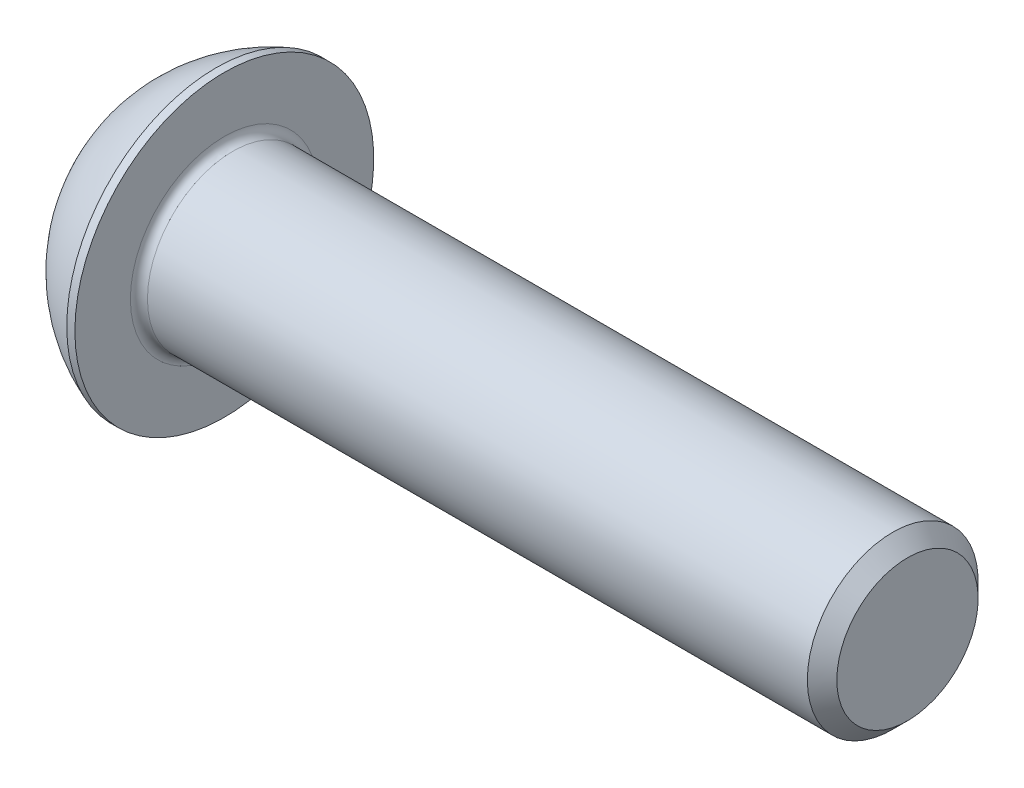
ISO-10303-21;
HEADER;
FILE_DESCRIPTION(('STEP AP214'),'2;1');
FILE_NAME('part.step','',(''),(''),'','','');
FILE_SCHEMA(('AUTOMOTIVE_DESIGN { 1 0 10303 214 1 1 1 1 }'));
ENDSEC;
DATA;
#1=APPLICATION_CONTEXT('core data for automotive mechanical design processes');
#2=APPLICATION_PROTOCOL_DEFINITION('international standard','automotive_design',2000,#1);
#3=PRODUCT_CONTEXT('',#1,'mechanical');
#4=PRODUCT('Part','Part','',(#3));
#5=PRODUCT_RELATED_PRODUCT_CATEGORY('part','',(#4));
#6=PRODUCT_DEFINITION_FORMATION('','',#4);
#7=PRODUCT_DEFINITION_CONTEXT('part definition',#1,'design');
#8=PRODUCT_DEFINITION('design','',#6,#7);
#9=PRODUCT_DEFINITION_SHAPE('','',#8);
#10=(LENGTH_UNIT() NAMED_UNIT(*) SI_UNIT(.MILLI.,.METRE.));
#11=(NAMED_UNIT(*) PLANE_ANGLE_UNIT() SI_UNIT($,.RADIAN.));
#12=(NAMED_UNIT(*) SI_UNIT($,.STERADIAN.) SOLID_ANGLE_UNIT());
#13=UNCERTAINTY_MEASURE_WITH_UNIT(LENGTH_MEASURE(1.E-05),#10,'distance_accuracy_value','');
#14=(GEOMETRIC_REPRESENTATION_CONTEXT(3) GLOBAL_UNCERTAINTY_ASSIGNED_CONTEXT((#13)) GLOBAL_UNIT_ASSIGNED_CONTEXT((#10,
#11,#12)) REPRESENTATION_CONTEXT('',''));
#15=CARTESIAN_POINT('',(0.,0.,0.));
#16=DIRECTION('',(0.,0.,1.));
#17=DIRECTION('',(1.,0.,0.));
#18=AXIS2_PLACEMENT_3D('',#15,#16,#17);
#19=CARTESIAN_POINT('',(0.,0.,0.));
#20=DIRECTION('',(-1.,0.,0.));
#21=DIRECTION('',(0.,0.,1.));
#22=AXIS2_PLACEMENT_3D('',#19,#20,#21);
#23=PLANE('',#22);
#24=CARTESIAN_POINT('',(0.,0.,0.));
#25=DIRECTION('',(-1.,0.,0.));
#26=DIRECTION('',(0.,0.,1.));
#27=AXIS2_PLACEMENT_3D('',#24,#25,#26);
#28=CIRCLE('',#27,3.5);
#29=CARTESIAN_POINT('',(0.,3.5,0.));
#30=VERTEX_POINT('',#29);
#31=EDGE_CURVE('E163',#30,#30,#28,.T.);
#32=ORIENTED_EDGE('',*,*,#31,.T.);
#33=EDGE_LOOP('',(#32));
#34=FACE_BOUND('',#33,.T.);
#35=DIRECTION('',(0.,-1.,0.));
#36=VECTOR('',#35,1.);
#37=CARTESIAN_POINT('',(0.,-1.44337567297406,2.5));
#38=LINE('',#37,#36);
#39=CARTESIAN_POINT('',(0.,1.44337567297406,2.5));
#40=VERTEX_POINT('',#39);
#41=CARTESIAN_POINT('',(0.,-1.44337567297406,2.5));
#42=VERTEX_POINT('',#41);
#43=EDGE_CURVE('E53',#40,#42,#38,.T.);
#44=ORIENTED_EDGE('',*,*,#43,.T.);
#45=DIRECTION('',(0.,-0.5,-0.866025403784439));
#46=VECTOR('',#45,1.);
#47=CARTESIAN_POINT('',(0.,-2.88675134594813,0.));
#48=LINE('',#47,#46);
#49=CARTESIAN_POINT('',(0.,-2.88675134594813,0.));
#50=VERTEX_POINT('',#49);
#51=EDGE_CURVE('E256',#42,#50,#48,.T.);
#52=ORIENTED_EDGE('',*,*,#51,.T.);
#53=DIRECTION('',(0.,0.5,-0.866025403784439));
#54=VECTOR('',#53,1.);
#55=CARTESIAN_POINT('',(0.,-1.44337567297406,-2.5));
#56=LINE('',#55,#54);
#57=CARTESIAN_POINT('',(0.,-1.44337567297406,-2.5));
#58=VERTEX_POINT('',#57);
#59=EDGE_CURVE('E138',#50,#58,#56,.T.);
#60=ORIENTED_EDGE('',*,*,#59,.T.);
#61=DIRECTION('',(0.,1.,0.));
#62=VECTOR('',#61,1.);
#63=CARTESIAN_POINT('',(0.,1.44337567297406,-2.5));
#64=LINE('',#63,#62);
#65=CARTESIAN_POINT('',(0.,1.44337567297406,-2.5));
#66=VERTEX_POINT('',#65);
#67=EDGE_CURVE('E259',#58,#66,#64,.T.);
#68=ORIENTED_EDGE('',*,*,#67,.T.);
#69=DIRECTION('',(0.,0.5,0.866025403784439));
#70=VECTOR('',#69,1.);
#71=CARTESIAN_POINT('',(0.,2.88675134594813,0.));
#72=LINE('',#71,#70);
#73=CARTESIAN_POINT('',(0.,2.88675134594813,0.));
#74=VERTEX_POINT('',#73);
#75=EDGE_CURVE('E261',#66,#74,#72,.T.);
#76=ORIENTED_EDGE('',*,*,#75,.T.);
#77=DIRECTION('',(0.,-0.5,0.866025403784439));
#78=VECTOR('',#77,1.);
#79=CARTESIAN_POINT('',(0.,1.44337567297406,2.5));
#80=LINE('',#79,#78);
#81=EDGE_CURVE('E263',#74,#40,#80,.T.);
#82=ORIENTED_EDGE('',*,*,#81,.T.);
#83=EDGE_LOOP('',(#44,#52,#60,#68,#76,#82));
#84=FACE_BOUND('',#83,.T.);
#85=ADVANCED_FACE('F38',(#34,#84),#23,.T.);
#86=CARTESIAN_POINT('',(6.58089552238806,0.,0.));
#87=DIRECTION('',(-1.,0.,0.));
#88=DIRECTION('',(0.,1.,0.));
#89=AXIS2_PLACEMENT_3D('',#86,#87,#88);
#90=SPHERICAL_SURFACE('',#89,7.45373637020972);
#91=CARTESIAN_POINT('',(4.02,0.,0.));
#92=DIRECTION('',(-1.,0.,0.));
#93=DIRECTION('',(0.,0.,1.));
#94=AXIS2_PLACEMENT_3D('',#91,#92,#93);
#95=CIRCLE('',#94,7.);
#96=CARTESIAN_POINT('',(4.02,7.,0.));
#97=VERTEX_POINT('',#96);
#98=EDGE_CURVE('E160',#97,#97,#95,.T.);
#99=CARTESIAN_POINT('',(4.02,7.,0.));
#100=CARTESIAN_POINT('',(3.96667727076465,6.98049242402172,0.));
#101=CARTESIAN_POINT('',(3.913577528648,6.96037534487455,0.));
#102=CARTESIAN_POINT('',(3.8078515532553,6.91893318326458,0.));
#103=CARTESIAN_POINT('',(3.75522531997925,6.89760810080177,0.));
#104=CARTESIAN_POINT('',(3.65047389687093,6.85376093558268,0.));
#105=CARTESIAN_POINT('',(3.59834870703866,6.83123885282639,0.));
#106=CARTESIAN_POINT('',(3.49462657751034,6.7850094841704,0.));
#107=CARTESIAN_POINT('',(3.44302963781429,6.7613021982707,0.));
#108=CARTESIAN_POINT('',(3.34039095714278,6.71271479411965,0.));
#109=CARTESIAN_POINT('',(3.28934921616733,6.6878346758683,0.));
#110=CARTESIAN_POINT('',(3.18784758682982,6.63691460241549,0.));
#111=CARTESIAN_POINT('',(3.13738769846775,6.61087464721403,0.));
#112=CARTESIAN_POINT('',(3.03707612567073,6.55764849769805,0.));
#113=CARTESIAN_POINT('',(2.98722444123577,6.53046230338352,0.));
#114=CARTESIAN_POINT('',(2.88815530965033,6.47495787293607,0.));
#115=CARTESIAN_POINT('',(2.83893786249984,6.44663963680314,0.));
#116=CARTESIAN_POINT('',(2.74116290772229,6.38888591095228,0.));
#117=CARTESIAN_POINT('',(2.69260540009523,6.35945042123436,0.));
#118=CARTESIAN_POINT('',(2.59617568194692,6.29947755995901,0.));
#119=CARTESIAN_POINT('',(2.54830347142567,6.2689401884016,0.));
#120=CARTESIAN_POINT('',(2.45326934720369,6.20677951059818,0.));
#121=CARTESIAN_POINT('',(2.40610743350296,6.17515620435217,0.));
#122=CARTESIAN_POINT('',(2.31251853170541,6.1108401714212,0.));
#123=CARTESIAN_POINT('',(2.2660915436086,6.07814744473625,0.));
#124=CARTESIAN_POINT('',(2.17399673801164,6.01170964364606,0.));
#125=CARTESIAN_POINT('',(2.12832892051151,5.97796456924083,0.));
#126=CARTESIAN_POINT('',(2.03777630464825,5.90943969498364,0.));
#127=CARTESIAN_POINT('',(1.99289150628513,5.87465989513168,0.));
#128=CARTESIAN_POINT('',(1.90392836832988,5.80408373260638,0.));
#129=CARTESIAN_POINT('',(1.85985002873775,5.76828736993305,0.));
#130=CARTESIAN_POINT('',(1.77252282681141,5.69569677525744,0.));
#131=CARTESIAN_POINT('',(1.72927396447721,5.65890254325517,0.));
#132=CARTESIAN_POINT('',(1.64362830238602,5.58433542451906,0.));
#133=CARTESIAN_POINT('',(1.60123150262904,5.54656253778523,0.));
#134=CARTESIAN_POINT('',(1.51731210604947,5.4700578352542,0.));
#135=CARTESIAN_POINT('',(1.47578950922687,5.431326019457,0.));
#136=CARTESIAN_POINT('',(1.39364020234904,5.35292368523707,0.));
#137=CARTESIAN_POINT('',(1.35301349229381,5.31325316681434,0.));
#138=CARTESIAN_POINT('',(1.27267717493576,5.23299414398831,0.));
#139=CARTESIAN_POINT('',(1.23296756763295,5.19240563958501,0.));
#140=CARTESIAN_POINT('',(1.15448619283766,5.1103318408312,0.));
#141=CARTESIAN_POINT('',(1.11571442534517,5.0688465464807,0.));
#142=CARTESIAN_POINT('',(1.03912897747163,4.98500083218559,0.));
#143=CARTESIAN_POINT('',(1.00131529709057,4.94264041224098,0.));
#144=CARTESIAN_POINT('',(0.926665770412102,4.85706656811615,0.));
#145=CARTESIAN_POINT('',(0.889829924114693,4.81385314393593,0.));
#146=CARTESIAN_POINT('',(0.817155301929323,4.72659585815459,0.));
#147=CARTESIAN_POINT('',(0.781316526041361,4.68255199655347,0.));
#148=CARTESIAN_POINT('',(0.710654760328621,4.59365683640532,0.));
#149=CARTESIAN_POINT('',(0.675831770503841,4.54880553785828,0.));
#150=CARTESIAN_POINT('',(0.607219762051194,4.45831892598402,0.));
#151=CARTESIAN_POINT('',(0.573430743423327,4.41268361265678,0.));
#152=CARTESIAN_POINT('',(0.506904322758881,4.32065280269138,0.));
#153=CARTESIAN_POINT('',(0.474166920722302,4.27425730605322,0.));
#154=CARTESIAN_POINT('',(0.409760828646038,4.18073035837463,0.));
#155=CARTESIAN_POINT('',(0.378092138606352,4.1335989073342,0.));
#156=CARTESIAN_POINT('',(0.31584001087466,4.03862466237799,0.));
#157=CARTESIAN_POINT('',(0.285256573182654,3.99078186846222,0.));
#158=CARTESIAN_POINT('',(0.2251909123934,3.89440992714022,0.));
#159=CARTESIAN_POINT('',(0.195708689296152,3.84588077973399,0.));
#160=CARTESIAN_POINT('',(0.137860887287448,3.74816145542334,0.));
#161=CARTESIAN_POINT('',(0.109495308375992,3.69897127851891,0.));
#162=CARTESIAN_POINT('',(0.0538954828937622,3.59995565329747,0.));
#163=CARTESIAN_POINT('',(0.0266612363229883,3.55013020498047,0.));
#164=CARTESIAN_POINT('',(0.,3.5,0.));
#165=B_SPLINE_CURVE_WITH_KNOTS('',3,(#99,#100,#101,#102,#103,#104,#105,#106,#107,#108,#109,#110,
#111,#112,#113,#114,#115,#116,#117,#118,#119,#120,#121,#122,#123,#124,#125,#126,#127,#128,#129,
#130,#131,#132,#133,#134,#135,#136,#137,#138,#139,#140,#141,#142,#143,#144,#145,#146,#147,#148,
#149,#150,#151,#152,#153,#154,#155,#156,#157,#158,#159,#160,#161,#162,#163,#164),.UNSPECIFIED.,
.F.,.F.,(4,2,2,2,2,2,2,2,2,2,2,2,2,2,2,2,2,2,2,2,2,2,2,2,2,2,2,2,2,2,2,2,4),(0.,
0.170333394580244,0.340666789160487,0.51100018374073,0.681333578320973,0.851666972901216,
1.02200036748146,1.1923337620617,1.36266715664194,1.53300055122219,1.70333394580243,
1.87366734038267,2.04400073496292,2.21433412954316,2.3846675241234,2.55500091870365,
2.72533431328389,2.89566770786413,3.06600110244437,3.23633449702462,3.40666789160486,
3.5770012861851,3.74733468076535,3.91766807534559,4.08800146992583,4.25833486450608,
4.42866825908632,4.59900165366656,4.76933504824681,4.93966844282705,5.11000183740729,
5.28033523198754,5.45066862656778),.UNSPECIFIED.);
#166=EDGE_CURVE('BSEAM184',#97,#30,#165,.T.);
#167=ORIENTED_EDGE('',*,*,#98,.T.);
#168=ORIENTED_EDGE('',*,*,#31,.F.);
#169=ORIENTED_EDGE('',*,*,#166,.T.);
#170=ORIENTED_EDGE('',*,*,#166,.F.);
#171=EDGE_LOOP('',(#167,#169,#168,#170));
#172=FACE_BOUND('',#171,.T.);
#173=ADVANCED_FACE('F184',(#172),#90,.T.);
#174=CARTESIAN_POINT('',(0.,0.,0.));
#175=DIRECTION('',(-1.,0.,0.));
#176=DIRECTION('',(0.,0.,1.));
#177=AXIS2_PLACEMENT_3D('',#174,#175,#176);
#178=CYLINDRICAL_SURFACE('',#177,7.);
#179=ORIENTED_EDGE('',*,*,#98,.F.);
#180=EDGE_LOOP('',(#179));
#181=FACE_BOUND('',#180,.T.);
#182=CARTESIAN_POINT('',(4.4,0.,0.));
#183=DIRECTION('',(-1.,0.,0.));
#184=DIRECTION('',(0.,0.,1.));
#185=AXIS2_PLACEMENT_3D('',#182,#183,#184);
#186=CIRCLE('',#185,7.);
#187=CARTESIAN_POINT('',(4.4,0.,7.));
#188=VERTEX_POINT('',#187);
#189=EDGE_CURVE('E157',#188,#188,#186,.T.);
#190=ORIENTED_EDGE('',*,*,#189,.T.);
#191=EDGE_LOOP('',(#190));
#192=FACE_BOUND('',#191,.T.);
#193=ADVANCED_FACE('F189',(#181,#192),#178,.T.);
#194=CARTESIAN_POINT('',(4.4,4.,0.));
#195=DIRECTION('',(-1.,0.,0.));
#196=DIRECTION('',(0.,0.,1.));
#197=AXIS2_PLACEMENT_3D('',#194,#195,#196);
#198=PLANE('',#197);
#199=CARTESIAN_POINT('',(4.4,0.,0.));
#200=DIRECTION('',(-1.,0.,0.));
#201=DIRECTION('',(0.,0.,1.));
#202=AXIS2_PLACEMENT_3D('',#199,#200,#201);
#203=CIRCLE('',#202,4.4);
#204=CARTESIAN_POINT('',(4.4,0.,4.4));
#205=VERTEX_POINT('',#204);
#206=EDGE_CURVE('E46',#205,#205,#203,.T.);
#207=ORIENTED_EDGE('',*,*,#206,.T.);
#208=EDGE_LOOP('',(#207));
#209=FACE_BOUND('',#208,.T.);
#210=ORIENTED_EDGE('',*,*,#189,.F.);
#211=EDGE_LOOP('',(#210));
#212=FACE_BOUND('',#211,.T.);
#213=ADVANCED_FACE('F168',(#209,#212),#198,.F.);
#214=CARTESIAN_POINT('',(0.,0.,0.));
#215=DIRECTION('',(-1.,0.,0.));
#216=DIRECTION('',(0.,0.,1.));
#217=AXIS2_PLACEMENT_3D('',#214,#215,#216);
#218=CYLINDRICAL_SURFACE('',#217,4.);
#219=CARTESIAN_POINT('',(4.8,0.,0.));
#220=DIRECTION('',(-1.,0.,0.));
#221=DIRECTION('',(0.,0.,1.));
#222=AXIS2_PLACEMENT_3D('',#219,#220,#221);
#223=CIRCLE('',#222,4.);
#224=CARTESIAN_POINT('',(4.8,0.,4.));
#225=VERTEX_POINT('',#224);
#226=EDGE_CURVE('E11',#225,#225,#223,.F.);
#227=ORIENTED_EDGE('',*,*,#226,.T.);
#228=EDGE_LOOP('',(#227));
#229=FACE_BOUND('',#228,.T.);
#230=CARTESIAN_POINT('',(35.7095,0.,0.));
#231=DIRECTION('',(-1.,0.,0.));
#232=DIRECTION('',(0.,0.,1.));
#233=AXIS2_PLACEMENT_3D('',#230,#231,#232);
#234=CIRCLE('',#233,4.);
#235=CARTESIAN_POINT('',(35.7095,0.,4.));
#236=VERTEX_POINT('',#235);
#237=EDGE_CURVE('E154',#236,#236,#234,.T.);
#238=ORIENTED_EDGE('',*,*,#237,.T.);
#239=EDGE_LOOP('',(#238));
#240=FACE_BOUND('',#239,.T.);
#241=ADVANCED_FACE('F198',(#229,#240),#218,.T.);
#242=CARTESIAN_POINT('',(36.4,0.,0.));
#243=DIRECTION('',(-1.,0.,0.));
#244=DIRECTION('',(0.,0.,1.));
#245=AXIS2_PLACEMENT_3D('',#242,#243,#244);
#246=CONICAL_SURFACE('',#245,3.3095,0.785398163397446);
#247=ORIENTED_EDGE('',*,*,#237,.F.);
#248=EDGE_LOOP('',(#247));
#249=FACE_BOUND('',#248,.T.);
#250=CARTESIAN_POINT('',(36.4,0.,0.));
#251=DIRECTION('',(-1.,0.,0.));
#252=DIRECTION('',(0.,0.,1.));
#253=AXIS2_PLACEMENT_3D('',#250,#251,#252);
#254=CIRCLE('',#253,3.3095);
#255=CARTESIAN_POINT('',(36.4,0.,3.3095));
#256=VERTEX_POINT('',#255);
#257=EDGE_CURVE('E150',#256,#256,#254,.T.);
#258=ORIENTED_EDGE('',*,*,#257,.T.);
#259=EDGE_LOOP('',(#258));
#260=FACE_BOUND('',#259,.T.);
#261=ADVANCED_FACE('F179',(#249,#260),#246,.T.);
#262=CARTESIAN_POINT('',(36.4,0.,0.));
#263=DIRECTION('',(-1.,0.,0.));
#264=DIRECTION('',(0.,0.,1.));
#265=AXIS2_PLACEMENT_3D('',#262,#263,#264);
#266=PLANE('',#265);
#267=ORIENTED_EDGE('',*,*,#257,.F.);
#268=EDGE_LOOP('',(#267));
#269=FACE_BOUND('',#268,.T.);
#270=ADVANCED_FACE('F172',(#269),#266,.F.);
#271=CARTESIAN_POINT('',(4.8,0.,0.));
#272=DIRECTION('',(-1.,0.,0.));
#273=DIRECTION('',(0.,0.,1.));
#274=AXIS2_PLACEMENT_3D('',#271,#272,#273);
#275=TOROIDAL_SURFACE('',#274,4.4,0.4);
#276=ORIENTED_EDGE('',*,*,#226,.F.);
#277=EDGE_LOOP('',(#276));
#278=FACE_BOUND('',#277,.T.);
#279=ORIENTED_EDGE('',*,*,#206,.F.);
#280=EDGE_LOOP('',(#279));
#281=FACE_BOUND('',#280,.T.);
#282=ADVANCED_FACE('F40',(#278,#281),#275,.F.);
#283=CARTESIAN_POINT('',(2.6,-2.88675134594813,0.));
#284=DIRECTION('',(0.,0.866025403784439,-0.5));
#285=DIRECTION('',(0.,0.5,0.866025403784439));
#286=AXIS2_PLACEMENT_3D('',#283,#284,#285);
#287=PLANE('',#286);
#288=DIRECTION('',(0.,-0.5,-0.866025403784439));
#289=VECTOR('',#288,1.);
#290=CARTESIAN_POINT('',(2.6,-2.88675134594813,0.));
#291=LINE('',#290,#289);
#292=CARTESIAN_POINT('',(2.6,-1.44337567297406,2.5));
#293=VERTEX_POINT('',#292);
#294=CARTESIAN_POINT('',(2.6,-2.1650635094611,1.25));
#295=VERTEX_POINT('',#294);
#296=EDGE_CURVE('E121',#293,#295,#291,.T.);
#297=ORIENTED_EDGE('',*,*,#296,.T.);
#298=CARTESIAN_POINT('',(2.6,-2.88675134594813,0.));
#299=VERTEX_POINT('',#298);
#300=EDGE_CURVE('E114',#295,#299,#291,.T.);
#301=ORIENTED_EDGE('',*,*,#300,.T.);
#302=DIRECTION('',(-1.,0.,0.));
#303=VECTOR('',#302,1.);
#304=CARTESIAN_POINT('',(2.6,-2.88675134594813,0.));
#305=LINE('',#304,#303);
#306=EDGE_CURVE('E118',#299,#50,#305,.T.);
#307=ORIENTED_EDGE('',*,*,#306,.T.);
#308=ORIENTED_EDGE('',*,*,#51,.F.);
#309=DIRECTION('',(-1.,0.,0.));
#310=VECTOR('',#309,1.);
#311=CARTESIAN_POINT('',(2.6,-1.44337567297406,2.5));
#312=LINE('',#311,#310);
#313=EDGE_CURVE('E246',#293,#42,#312,.T.);
#314=ORIENTED_EDGE('',*,*,#313,.F.);
#315=EDGE_LOOP('',(#297,#301,#307,#308,#314));
#316=FACE_BOUND('',#315,.T.);
#317=ADVANCED_FACE('F116',(#316),#287,.T.);
#318=CARTESIAN_POINT('',(2.6,-1.44337567297406,-2.5));
#319=DIRECTION('',(0.,0.866025403784439,0.5));
#320=DIRECTION('',(0.,-0.5,0.866025403784439));
#321=AXIS2_PLACEMENT_3D('',#318,#319,#320);
#322=PLANE('',#321);
#323=DIRECTION('',(0.,0.5,-0.866025403784439));
#324=VECTOR('',#323,1.);
#325=CARTESIAN_POINT('',(2.6,-1.44337567297406,-2.5));
#326=LINE('',#325,#324);
#327=CARTESIAN_POINT('',(2.6,-2.1650635094611,-1.25));
#328=VERTEX_POINT('',#327);
#329=EDGE_CURVE('E126',#299,#328,#326,.T.);
#330=ORIENTED_EDGE('',*,*,#329,.T.);
#331=CARTESIAN_POINT('',(2.6,-1.44337567297406,-2.5));
#332=VERTEX_POINT('',#331);
#333=EDGE_CURVE('E133',#328,#332,#326,.T.);
#334=ORIENTED_EDGE('',*,*,#333,.T.);
#335=DIRECTION('',(-1.,0.,0.));
#336=VECTOR('',#335,1.);
#337=CARTESIAN_POINT('',(2.6,-1.44337567297406,-2.5));
#338=LINE('',#337,#336);
#339=EDGE_CURVE('E140',#332,#58,#338,.T.);
#340=ORIENTED_EDGE('',*,*,#339,.T.);
#341=ORIENTED_EDGE('',*,*,#59,.F.);
#342=ORIENTED_EDGE('',*,*,#306,.F.);
#343=EDGE_LOOP('',(#330,#334,#340,#341,#342));
#344=FACE_BOUND('',#343,.T.);
#345=ADVANCED_FACE('F136',(#344),#322,.T.);
#346=CARTESIAN_POINT('',(2.6,1.44337567297406,-2.5));
#347=DIRECTION('',(0.,0.,1.));
#348=DIRECTION('',(0.,-1.,0.));
#349=AXIS2_PLACEMENT_3D('',#346,#347,#348);
#350=PLANE('',#349);
#351=DIRECTION('',(0.,1.,0.));
#352=VECTOR('',#351,1.);
#353=CARTESIAN_POINT('',(2.6,1.44337567297406,-2.5));
#354=LINE('',#353,#352);
#355=CARTESIAN_POINT('',(2.6,0.,-2.5));
#356=VERTEX_POINT('',#355);
#357=EDGE_CURVE('E282',#332,#356,#354,.T.);
#358=ORIENTED_EDGE('',*,*,#357,.T.);
#359=CARTESIAN_POINT('',(2.6,1.44337567297406,-2.5));
#360=VERTEX_POINT('',#359);
#361=EDGE_CURVE('E132',#356,#360,#354,.T.);
#362=ORIENTED_EDGE('',*,*,#361,.T.);
#363=DIRECTION('',(-1.,0.,0.));
#364=VECTOR('',#363,1.);
#365=CARTESIAN_POINT('',(2.6,1.44337567297406,-2.5));
#366=LINE('',#365,#364);
#367=EDGE_CURVE('E145',#360,#66,#366,.T.);
#368=ORIENTED_EDGE('',*,*,#367,.T.);
#369=ORIENTED_EDGE('',*,*,#67,.F.);
#370=ORIENTED_EDGE('',*,*,#339,.F.);
#371=EDGE_LOOP('',(#358,#362,#368,#369,#370));
#372=FACE_BOUND('',#371,.T.);
#373=ADVANCED_FACE('F212',(#372),#350,.T.);
#374=CARTESIAN_POINT('',(2.6,2.88675134594813,0.));
#375=DIRECTION('',(0.,-0.866025403784439,0.5));
#376=DIRECTION('',(0.,-0.5,-0.866025403784439));
#377=AXIS2_PLACEMENT_3D('',#374,#375,#376);
#378=PLANE('',#377);
#379=DIRECTION('',(0.,0.5,0.866025403784439));
#380=VECTOR('',#379,1.);
#381=CARTESIAN_POINT('',(2.6,2.88675134594813,0.));
#382=LINE('',#381,#380);
#383=CARTESIAN_POINT('',(2.6,2.1650635094611,-1.25));
#384=VERTEX_POINT('',#383);
#385=EDGE_CURVE('E288',#360,#384,#382,.T.);
#386=ORIENTED_EDGE('',*,*,#385,.T.);
#387=CARTESIAN_POINT('',(2.6,2.88675134594813,0.));
#388=VERTEX_POINT('',#387);
#389=EDGE_CURVE('E286',#384,#388,#382,.T.);
#390=ORIENTED_EDGE('',*,*,#389,.T.);
#391=DIRECTION('',(-1.,0.,0.));
#392=VECTOR('',#391,1.);
#393=CARTESIAN_POINT('',(2.6,2.88675134594813,0.));
#394=LINE('',#393,#392);
#395=EDGE_CURVE('E268',#388,#74,#394,.T.);
#396=ORIENTED_EDGE('',*,*,#395,.T.);
#397=ORIENTED_EDGE('',*,*,#75,.F.);
#398=ORIENTED_EDGE('',*,*,#367,.F.);
#399=EDGE_LOOP('',(#386,#390,#396,#397,#398));
#400=FACE_BOUND('',#399,.T.);
#401=ADVANCED_FACE('F215',(#400),#378,.T.);
#402=CARTESIAN_POINT('',(2.6,1.44337567297406,2.5));
#403=DIRECTION('',(0.,-0.866025403784439,-0.5));
#404=DIRECTION('',(0.,0.5,-0.866025403784439));
#405=AXIS2_PLACEMENT_3D('',#402,#403,#404);
#406=PLANE('',#405);
#407=DIRECTION('',(0.,-0.5,0.866025403784439));
#408=VECTOR('',#407,1.);
#409=CARTESIAN_POINT('',(2.6,1.44337567297406,2.5));
#410=LINE('',#409,#408);
#411=CARTESIAN_POINT('',(2.6,2.1650635094611,1.25));
#412=VERTEX_POINT('',#411);
#413=EDGE_CURVE('E252',#388,#412,#410,.T.);
#414=ORIENTED_EDGE('',*,*,#413,.T.);
#415=CARTESIAN_POINT('',(2.6,1.44337567297406,2.5));
#416=VERTEX_POINT('',#415);
#417=EDGE_CURVE('E244',#412,#416,#410,.T.);
#418=ORIENTED_EDGE('',*,*,#417,.T.);
#419=DIRECTION('',(-1.,0.,0.));
#420=VECTOR('',#419,1.);
#421=CARTESIAN_POINT('',(2.6,1.44337567297406,2.5));
#422=LINE('',#421,#420);
#423=EDGE_CURVE('E250',#416,#40,#422,.T.);
#424=ORIENTED_EDGE('',*,*,#423,.T.);
#425=ORIENTED_EDGE('',*,*,#81,.F.);
#426=ORIENTED_EDGE('',*,*,#395,.F.);
#427=EDGE_LOOP('',(#414,#418,#424,#425,#426));
#428=FACE_BOUND('',#427,.T.);
#429=ADVANCED_FACE('F219',(#428),#406,.T.);
#430=CARTESIAN_POINT('',(2.6,-1.44337567297406,2.5));
#431=DIRECTION('',(0.,0.,-1.));
#432=DIRECTION('',(-1.,0.,0.));
#433=AXIS2_PLACEMENT_3D('',#430,#431,#432);
#434=PLANE('',#433);
#435=DIRECTION('',(0.,-1.,0.));
#436=VECTOR('',#435,1.);
#437=CARTESIAN_POINT('',(2.6,-1.44337567297406,2.5));
#438=LINE('',#437,#436);
#439=CARTESIAN_POINT('',(2.6,0.,2.5));
#440=VERTEX_POINT('',#439);
#441=EDGE_CURVE('E61',#416,#440,#438,.T.);
#442=ORIENTED_EDGE('',*,*,#441,.T.);
#443=EDGE_CURVE('E247',#440,#293,#438,.T.);
#444=ORIENTED_EDGE('',*,*,#443,.T.);
#445=ORIENTED_EDGE('',*,*,#313,.T.);
#446=ORIENTED_EDGE('',*,*,#43,.F.);
#447=ORIENTED_EDGE('',*,*,#423,.F.);
#448=EDGE_LOOP('',(#442,#444,#445,#446,#447));
#449=FACE_BOUND('',#448,.T.);
#450=ADVANCED_FACE('F223',(#449),#434,.T.);
#451=CARTESIAN_POINT('',(2.6,0.,5.));
#452=DIRECTION('',(-1.,0.,0.));
#453=DIRECTION('',(0.,0.,1.));
#454=AXIS2_PLACEMENT_3D('',#451,#452,#453);
#455=PLANE('',#454);
#456=ORIENTED_EDGE('',*,*,#441,.F.);
#457=ORIENTED_EDGE('',*,*,#417,.F.);
#458=CARTESIAN_POINT('',(2.6,0.,0.));
#459=DIRECTION('',(-1.,0.,0.));
#460=DIRECTION('',(0.,0.,1.));
#461=AXIS2_PLACEMENT_3D('',#458,#459,#460);
#462=CIRCLE('',#461,2.5);
#463=EDGE_CURVE('E144',#440,#412,#462,.T.);
#464=ORIENTED_EDGE('',*,*,#463,.F.);
#465=EDGE_LOOP('',(#456,#457,#464));
#466=FACE_BOUND('',#465,.T.);
#467=ADVANCED_FACE('F227',(#466),#455,.T.);
#468=ORIENTED_EDGE('',*,*,#413,.F.);
#469=ORIENTED_EDGE('',*,*,#389,.F.);
#470=EDGE_CURVE('E151',#412,#384,#462,.T.);
#471=ORIENTED_EDGE('',*,*,#470,.F.);
#472=EDGE_LOOP('',(#468,#469,#471));
#473=FACE_BOUND('',#472,.T.);
#474=ADVANCED_FACE('F235',(#473),#455,.T.);
#475=ORIENTED_EDGE('',*,*,#385,.F.);
#476=ORIENTED_EDGE('',*,*,#361,.F.);
#477=EDGE_CURVE('E293',#384,#356,#462,.T.);
#478=ORIENTED_EDGE('',*,*,#477,.F.);
#479=EDGE_LOOP('',(#475,#476,#478));
#480=FACE_BOUND('',#479,.T.);
#481=ADVANCED_FACE('F240',(#480),#455,.T.);
#482=ORIENTED_EDGE('',*,*,#357,.F.);
#483=ORIENTED_EDGE('',*,*,#333,.F.);
#484=EDGE_CURVE('E285',#356,#328,#462,.T.);
#485=ORIENTED_EDGE('',*,*,#484,.F.);
#486=EDGE_LOOP('',(#482,#483,#485));
#487=FACE_BOUND('',#486,.T.);
#488=ADVANCED_FACE('F233',(#487),#455,.T.);
#489=ORIENTED_EDGE('',*,*,#329,.F.);
#490=ORIENTED_EDGE('',*,*,#300,.F.);
#491=EDGE_CURVE('E128',#328,#295,#462,.T.);
#492=ORIENTED_EDGE('',*,*,#491,.F.);
#493=EDGE_LOOP('',(#489,#490,#492));
#494=FACE_BOUND('',#493,.T.);
#495=ADVANCED_FACE('F127',(#494),#455,.T.);
#496=ORIENTED_EDGE('',*,*,#296,.F.);
#497=ORIENTED_EDGE('',*,*,#443,.F.);
#498=EDGE_CURVE('E139',#295,#440,#462,.T.);
#499=ORIENTED_EDGE('',*,*,#498,.F.);
#500=EDGE_LOOP('',(#496,#497,#499));
#501=FACE_BOUND('',#500,.T.);
#502=ADVANCED_FACE('F207',(#501),#455,.T.);
#503=CARTESIAN_POINT('',(4.04337567297408,0.,0.));
#504=DIRECTION('',(-1.,0.,0.));
#505=DIRECTION('',(0.,0.,1.));
#506=AXIS2_PLACEMENT_3D('',#503,#504,#505);
#507=CONICAL_SURFACE('',#506,0.,1.04719755119659);
#508=ORIENTED_EDGE('',*,*,#463,.T.);
#509=ORIENTED_EDGE('',*,*,#470,.T.);
#510=ORIENTED_EDGE('',*,*,#477,.T.);
#511=ORIENTED_EDGE('',*,*,#484,.T.);
#512=ORIENTED_EDGE('',*,*,#491,.T.);
#513=ORIENTED_EDGE('',*,*,#498,.T.);
#514=EDGE_LOOP('',(#508,#509,#510,#511,#512,#513));
#515=FACE_BOUND('',#514,.T.);
#516=CARTESIAN_POINT('',(4.04337567297408,0.,0.));
#517=VERTEX_POINT('',#516);
#518=VERTEX_LOOP('',#517);
#519=FACE_BOUND('',#518,.T.);
#520=ADVANCED_FACE('F205',(#515,#519),#507,.F.);
#521=CLOSED_SHELL('',(#85,#173,#193,#213,#241,#261,#270,#282,#317,#345,#373,#401,#429,#450,#467,
#474,#481,#488,#495,#502,#520));
#522=MANIFOLD_SOLID_BREP('B2',#521);
#523=ADVANCED_BREP_SHAPE_REPRESENTATION('',(#18,#522),#14);
#524=SHAPE_DEFINITION_REPRESENTATION(#9,#523);
ENDSEC;
END-ISO-10303-21;
